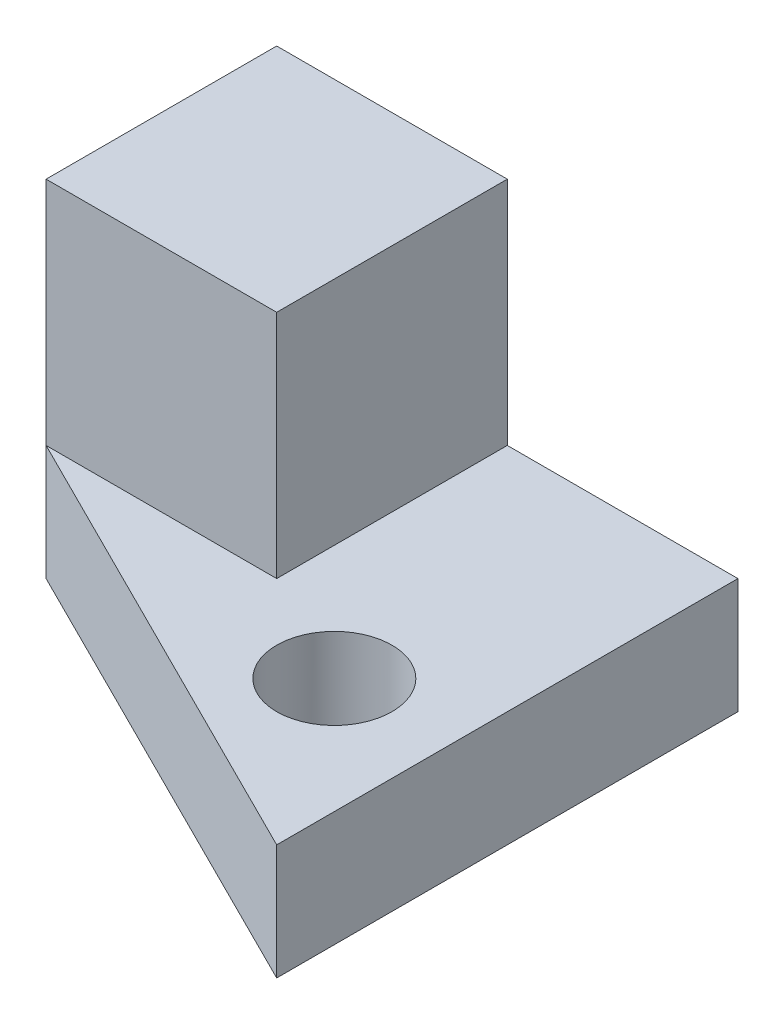
ISO-10303-21;
HEADER;
FILE_DESCRIPTION(('STEP AP214'),'2;1');
FILE_NAME('part.step','',(''),(''),'','','');
FILE_SCHEMA(('AUTOMOTIVE_DESIGN { 1 0 10303 214 1 1 1 1 }'));
ENDSEC;
DATA;
#1=APPLICATION_CONTEXT('core data for automotive mechanical design processes');
#2=APPLICATION_PROTOCOL_DEFINITION('international standard','automotive_design',2000,#1);
#3=PRODUCT_CONTEXT('',#1,'mechanical');
#4=PRODUCT('Part','Part','',(#3));
#5=PRODUCT_RELATED_PRODUCT_CATEGORY('part','',(#4));
#6=PRODUCT_DEFINITION_FORMATION('','',#4);
#7=PRODUCT_DEFINITION_CONTEXT('part definition',#1,'design');
#8=PRODUCT_DEFINITION('design','',#6,#7);
#9=PRODUCT_DEFINITION_SHAPE('','',#8);
#10=(LENGTH_UNIT() NAMED_UNIT(*) SI_UNIT(.MILLI.,.METRE.));
#11=(NAMED_UNIT(*) PLANE_ANGLE_UNIT() SI_UNIT($,.RADIAN.));
#12=(NAMED_UNIT(*) SI_UNIT($,.STERADIAN.) SOLID_ANGLE_UNIT());
#13=UNCERTAINTY_MEASURE_WITH_UNIT(LENGTH_MEASURE(1.E-05),#10,'distance_accuracy_value','');
#14=(GEOMETRIC_REPRESENTATION_CONTEXT(3) GLOBAL_UNCERTAINTY_ASSIGNED_CONTEXT((#13)) GLOBAL_UNIT_ASSIGNED_CONTEXT((#10,
#11,#12)) REPRESENTATION_CONTEXT('',''));
#15=CARTESIAN_POINT('',(0.,0.,0.));
#16=DIRECTION('',(0.,0.,1.));
#17=DIRECTION('',(1.,0.,0.));
#18=AXIS2_PLACEMENT_3D('',#15,#16,#17);
#19=CARTESIAN_POINT('',(1016.,1016.,-1016.));
#20=DIRECTION('',(1.,0.,0.));
#21=DIRECTION('',(0.,0.,-1.));
#22=AXIS2_PLACEMENT_3D('',#19,#20,#21);
#23=PLANE('',#22);
#24=DIRECTION('',(0.,0.,-1.));
#25=VECTOR('',#24,1.);
#26=CARTESIAN_POINT('',(1016.,254.,-1016.));
#27=LINE('',#26,#25);
#28=CARTESIAN_POINT('',(1016.,254.,0.));
#29=VERTEX_POINT('',#28);
#30=CARTESIAN_POINT('',(1016.,254.,-1016.));
#31=VERTEX_POINT('',#30);
#32=EDGE_CURVE('E140',#29,#31,#27,.T.);
#33=ORIENTED_EDGE('',*,*,#32,.F.);
#34=DIRECTION('',(0.,-1.,0.));
#35=VECTOR('',#34,1.);
#36=CARTESIAN_POINT('',(1016.,1016.,0.));
#37=LINE('',#36,#35);
#38=CARTESIAN_POINT('',(1016.,0.,0.));
#39=VERTEX_POINT('',#38);
#40=EDGE_CURVE('E44',#29,#39,#37,.T.);
#41=ORIENTED_EDGE('',*,*,#40,.T.);
#42=DIRECTION('',(0.,0.,1.));
#43=VECTOR('',#42,1.);
#44=CARTESIAN_POINT('',(1016.,0.,-1016.));
#45=LINE('',#44,#43);
#46=CARTESIAN_POINT('',(1016.,0.,-1016.));
#47=VERTEX_POINT('',#46);
#48=EDGE_CURVE('E122',#47,#39,#45,.T.);
#49=ORIENTED_EDGE('',*,*,#48,.F.);
#50=DIRECTION('',(0.,-1.,0.));
#51=VECTOR('',#50,1.);
#52=CARTESIAN_POINT('',(1016.,1016.,-1016.));
#53=LINE('',#52,#51);
#54=EDGE_CURVE('E133',#31,#47,#53,.T.);
#55=ORIENTED_EDGE('',*,*,#54,.F.);
#56=EDGE_LOOP('',(#33,#41,#49,#55));
#57=FACE_BOUND('',#56,.T.);
#58=ADVANCED_FACE('F37',(#57),#23,.T.);
#59=CARTESIAN_POINT('',(0.,1016.,-1016.));
#60=DIRECTION('',(0.,0.,-1.));
#61=DIRECTION('',(-1.,0.,0.));
#62=AXIS2_PLACEMENT_3D('',#59,#60,#61);
#63=PLANE('',#62);
#64=DIRECTION('',(-1.,0.,0.));
#65=VECTOR('',#64,1.);
#66=CARTESIAN_POINT('',(0.,762.,-1016.));
#67=LINE('',#66,#65);
#68=CARTESIAN_POINT('',(508.,762.,-1016.));
#69=VERTEX_POINT('',#68);
#70=CARTESIAN_POINT('',(0.,762.,-1016.));
#71=VERTEX_POINT('',#70);
#72=EDGE_CURVE('E93',#69,#71,#67,.T.);
#73=ORIENTED_EDGE('',*,*,#72,.F.);
#74=DIRECTION('',(0.,1.,0.));
#75=VECTOR('',#74,1.);
#76=CARTESIAN_POINT('',(508.,254.,-1016.));
#77=LINE('',#76,#75);
#78=CARTESIAN_POINT('',(508.,254.,-1016.));
#79=VERTEX_POINT('',#78);
#80=EDGE_CURVE('E114',#79,#69,#77,.T.);
#81=ORIENTED_EDGE('',*,*,#80,.F.);
#82=DIRECTION('',(-1.,0.,0.));
#83=VECTOR('',#82,1.);
#84=CARTESIAN_POINT('',(508.,254.,-1016.));
#85=LINE('',#84,#83);
#86=EDGE_CURVE('E151',#31,#79,#85,.T.);
#87=ORIENTED_EDGE('',*,*,#86,.F.);
#88=ORIENTED_EDGE('',*,*,#54,.T.);
#89=DIRECTION('',(1.,0.,0.));
#90=VECTOR('',#89,1.);
#91=CARTESIAN_POINT('',(0.,0.,-1016.));
#92=LINE('',#91,#90);
#93=CARTESIAN_POINT('',(0.,0.,-1016.));
#94=VERTEX_POINT('',#93);
#95=EDGE_CURVE('E125',#94,#47,#92,.T.);
#96=ORIENTED_EDGE('',*,*,#95,.F.);
#97=DIRECTION('',(0.,-1.,0.));
#98=VECTOR('',#97,1.);
#99=CARTESIAN_POINT('',(0.,1016.,-1016.));
#100=LINE('',#99,#98);
#101=EDGE_CURVE('E131',#71,#94,#100,.T.);
#102=ORIENTED_EDGE('',*,*,#101,.F.);
#103=EDGE_LOOP('',(#73,#81,#87,#88,#96,#102));
#104=FACE_BOUND('',#103,.T.);
#105=ADVANCED_FACE('F147',(#104),#63,.T.);
#106=CARTESIAN_POINT('',(0.,1016.,0.));
#107=DIRECTION('',(-1.,0.,0.));
#108=DIRECTION('',(0.,0.,1.));
#109=AXIS2_PLACEMENT_3D('',#106,#107,#108);
#110=PLANE('',#109);
#111=DIRECTION('',(0.,0.,1.));
#112=VECTOR('',#111,1.);
#113=CARTESIAN_POINT('',(0.,762.,-1270.));
#114=LINE('',#113,#112);
#115=CARTESIAN_POINT('',(0.,762.,-508.));
#116=VERTEX_POINT('',#115);
#117=EDGE_CURVE('E90',#71,#116,#114,.T.);
#118=ORIENTED_EDGE('',*,*,#117,.F.);
#119=ORIENTED_EDGE('',*,*,#101,.T.);
#120=DIRECTION('',(0.,0.,-1.));
#121=VECTOR('',#120,1.);
#122=CARTESIAN_POINT('',(0.,0.,0.));
#123=LINE('',#122,#121);
#124=CARTESIAN_POINT('',(0.,0.,-508.));
#125=VERTEX_POINT('',#124);
#126=EDGE_CURVE('E128',#125,#94,#123,.T.);
#127=ORIENTED_EDGE('',*,*,#126,.F.);
#128=DIRECTION('',(0.,1.,0.));
#129=VECTOR('',#128,1.);
#130=CARTESIAN_POINT('',(0.,0.,-508.));
#131=LINE('',#130,#129);
#132=CARTESIAN_POINT('',(0.,254.,-508.));
#133=VERTEX_POINT('',#132);
#134=EDGE_CURVE('E109',#125,#133,#131,.T.);
#135=ORIENTED_EDGE('',*,*,#134,.T.);
#136=DIRECTION('',(0.,1.,0.));
#137=VECTOR('',#136,1.);
#138=CARTESIAN_POINT('',(0.,254.,-508.));
#139=LINE('',#138,#137);
#140=EDGE_CURVE('E101',#133,#116,#139,.T.);
#141=ORIENTED_EDGE('',*,*,#140,.T.);
#142=EDGE_LOOP('',(#118,#119,#127,#135,#141));
#143=FACE_BOUND('',#142,.T.);
#144=ADVANCED_FACE('F107',(#143),#110,.T.);
#145=CARTESIAN_POINT('',(0.,0.,0.));
#146=DIRECTION('',(0.,-1.,0.));
#147=DIRECTION('',(0.,0.,-1.));
#148=AXIS2_PLACEMENT_3D('',#145,#146,#147);
#149=PLANE('',#148);
#150=CARTESIAN_POINT('',(762.,0.,-381.));
#151=DIRECTION('',(0.,-1.,0.));
#152=DIRECTION('',(0.,0.,-1.));
#153=AXIS2_PLACEMENT_3D('',#150,#151,#152);
#154=CIRCLE('',#153,127.);
#155=CARTESIAN_POINT('',(762.,0.,-508.));
#156=VERTEX_POINT('',#155);
#157=EDGE_CURVE('E104',#156,#156,#154,.T.);
#158=ORIENTED_EDGE('',*,*,#157,.F.);
#159=EDGE_LOOP('',(#158));
#160=FACE_BOUND('',#159,.T.);
#161=DIRECTION('',(-0.894427190999916,0.,-0.447213595499958));
#162=VECTOR('',#161,1.);
#163=CARTESIAN_POINT('',(1016.,0.,0.));
#164=LINE('',#163,#162);
#165=EDGE_CURVE('E110',#39,#125,#164,.T.);
#166=ORIENTED_EDGE('',*,*,#165,.T.);
#167=ORIENTED_EDGE('',*,*,#126,.T.);
#168=ORIENTED_EDGE('',*,*,#95,.T.);
#169=ORIENTED_EDGE('',*,*,#48,.T.);
#170=EDGE_LOOP('',(#166,#167,#168,#169));
#171=FACE_BOUND('',#170,.T.);
#172=ADVANCED_FACE('F144',(#160,#171),#149,.T.);
#173=CARTESIAN_POINT('',(1016.,0.,0.));
#174=DIRECTION('',(0.447213595499958,0.,-0.894427190999916));
#175=DIRECTION('',(-0.894427190999916,0.,-0.447213595499958));
#176=AXIS2_PLACEMENT_3D('',#173,#174,#175);
#177=PLANE('',#176);
#178=ORIENTED_EDGE('',*,*,#40,.F.);
#179=DIRECTION('',(0.894427190999916,0.,0.447213595499958));
#180=VECTOR('',#179,1.);
#181=CARTESIAN_POINT('',(1016.,254.,0.));
#182=LINE('',#181,#180);
#183=EDGE_CURVE('E154',#133,#29,#182,.T.);
#184=ORIENTED_EDGE('',*,*,#183,.F.);
#185=ORIENTED_EDGE('',*,*,#134,.F.);
#186=ORIENTED_EDGE('',*,*,#165,.F.);
#187=EDGE_LOOP('',(#178,#184,#185,#186));
#188=FACE_BOUND('',#187,.T.);
#189=ADVANCED_FACE('F142',(#188),#177,.F.);
#190=CARTESIAN_POINT('',(0.,254.,-508.));
#191=DIRECTION('',(0.,0.,-1.));
#192=DIRECTION('',(-1.,0.,0.));
#193=AXIS2_PLACEMENT_3D('',#190,#191,#192);
#194=PLANE('',#193);
#195=DIRECTION('',(0.,1.,0.));
#196=VECTOR('',#195,1.);
#197=CARTESIAN_POINT('',(508.,254.,-508.));
#198=LINE('',#197,#196);
#199=CARTESIAN_POINT('',(508.,254.,-508.));
#200=VERTEX_POINT('',#199);
#201=CARTESIAN_POINT('',(508.,762.,-508.));
#202=VERTEX_POINT('',#201);
#203=EDGE_CURVE('E103',#200,#202,#198,.T.);
#204=ORIENTED_EDGE('',*,*,#203,.T.);
#205=DIRECTION('',(1.,0.,0.));
#206=VECTOR('',#205,1.);
#207=CARTESIAN_POINT('',(0.,762.,-508.));
#208=LINE('',#207,#206);
#209=EDGE_CURVE('E51',#116,#202,#208,.T.);
#210=ORIENTED_EDGE('',*,*,#209,.F.);
#211=ORIENTED_EDGE('',*,*,#140,.F.);
#212=DIRECTION('',(-1.,0.,0.));
#213=VECTOR('',#212,1.);
#214=CARTESIAN_POINT('',(0.,254.,-508.));
#215=LINE('',#214,#213);
#216=EDGE_CURVE('E58',#200,#133,#215,.T.);
#217=ORIENTED_EDGE('',*,*,#216,.F.);
#218=EDGE_LOOP('',(#204,#210,#211,#217));
#219=FACE_BOUND('',#218,.T.);
#220=ADVANCED_FACE('F100',(#219),#194,.F.);
#221=CARTESIAN_POINT('',(508.,254.,-508.));
#222=DIRECTION('',(-1.,0.,0.));
#223=DIRECTION('',(0.,0.,1.));
#224=AXIS2_PLACEMENT_3D('',#221,#222,#223);
#225=PLANE('',#224);
#226=ORIENTED_EDGE('',*,*,#80,.T.);
#227=DIRECTION('',(0.,0.,1.));
#228=VECTOR('',#227,1.);
#229=CARTESIAN_POINT('',(508.,762.,-508.));
#230=LINE('',#229,#228);
#231=EDGE_CURVE('E11',#69,#202,#230,.T.);
#232=ORIENTED_EDGE('',*,*,#231,.T.);
#233=ORIENTED_EDGE('',*,*,#203,.F.);
#234=DIRECTION('',(0.,0.,1.));
#235=VECTOR('',#234,1.);
#236=CARTESIAN_POINT('',(508.,254.,-508.));
#237=LINE('',#236,#235);
#238=EDGE_CURVE('E152',#79,#200,#237,.T.);
#239=ORIENTED_EDGE('',*,*,#238,.F.);
#240=EDGE_LOOP('',(#226,#232,#233,#239));
#241=FACE_BOUND('',#240,.T.);
#242=ADVANCED_FACE('F169',(#241),#225,.F.);
#243=CARTESIAN_POINT('',(0.,254.,0.));
#244=DIRECTION('',(0.,-1.,0.));
#245=DIRECTION('',(0.,0.,-1.));
#246=AXIS2_PLACEMENT_3D('',#243,#244,#245);
#247=PLANE('',#246);
#248=CARTESIAN_POINT('',(762.,254.,-381.));
#249=DIRECTION('',(0.,1.,0.));
#250=DIRECTION('',(0.,0.,1.));
#251=AXIS2_PLACEMENT_3D('',#248,#249,#250);
#252=CIRCLE('',#251,127.);
#253=CARTESIAN_POINT('',(762.,254.,-254.));
#254=VERTEX_POINT('',#253);
#255=EDGE_CURVE('E161',#254,#254,#252,.T.);
#256=ORIENTED_EDGE('',*,*,#255,.F.);
#257=EDGE_LOOP('',(#256));
#258=FACE_BOUND('',#257,.T.);
#259=ORIENTED_EDGE('',*,*,#183,.T.);
#260=ORIENTED_EDGE('',*,*,#32,.T.);
#261=ORIENTED_EDGE('',*,*,#86,.T.);
#262=ORIENTED_EDGE('',*,*,#238,.T.);
#263=ORIENTED_EDGE('',*,*,#216,.T.);
#264=EDGE_LOOP('',(#259,#260,#261,#262,#263));
#265=FACE_BOUND('',#264,.T.);
#266=ADVANCED_FACE('F167',(#258,#265),#247,.F.);
#267=CARTESIAN_POINT('',(0.,762.,-1270.));
#268=DIRECTION('',(0.,-1.,0.));
#269=DIRECTION('',(0.,0.,-1.));
#270=AXIS2_PLACEMENT_3D('',#267,#268,#269);
#271=PLANE('',#270);
#272=ORIENTED_EDGE('',*,*,#72,.T.);
#273=ORIENTED_EDGE('',*,*,#117,.T.);
#274=ORIENTED_EDGE('',*,*,#209,.T.);
#275=ORIENTED_EDGE('',*,*,#231,.F.);
#276=EDGE_LOOP('',(#272,#273,#274,#275));
#277=FACE_BOUND('',#276,.T.);
#278=ADVANCED_FACE('F91',(#277),#271,.F.);
#279=CARTESIAN_POINT('',(762.,-508.,-381.));
#280=DIRECTION('',(0.,1.,0.));
#281=DIRECTION('',(0.,0.,1.));
#282=AXIS2_PLACEMENT_3D('',#279,#280,#281);
#283=CYLINDRICAL_SURFACE('',#282,127.);
#284=ORIENTED_EDGE('',*,*,#157,.T.);
#285=EDGE_LOOP('',(#284));
#286=FACE_BOUND('',#285,.T.);
#287=ORIENTED_EDGE('',*,*,#255,.T.);
#288=EDGE_LOOP('',(#287));
#289=FACE_BOUND('',#288,.T.);
#290=ADVANCED_FACE('F165',(#286,#289),#283,.F.);
#291=CLOSED_SHELL('',(#58,#105,#144,#172,#189,#220,#242,#266,#278,#290));
#292=MANIFOLD_SOLID_BREP('B2',#291);
#293=ADVANCED_BREP_SHAPE_REPRESENTATION('',(#18,#292),#14);
#294=SHAPE_DEFINITION_REPRESENTATION(#9,#293);
ENDSEC;
END-ISO-10303-21;
